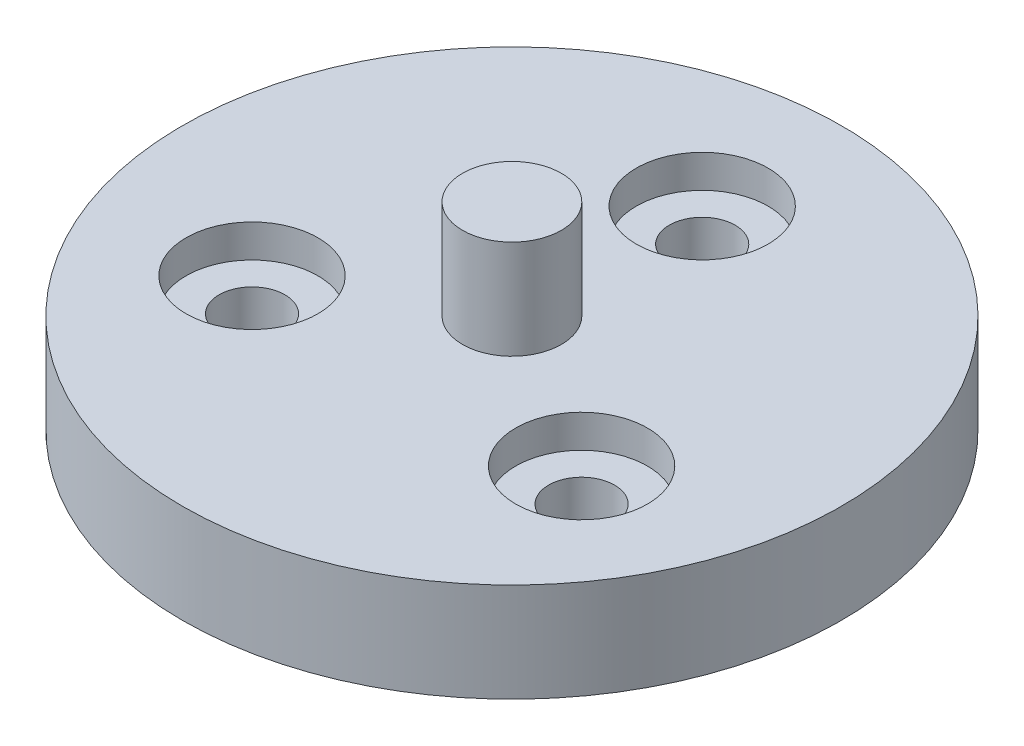
ISO-10303-21;
HEADER;
FILE_DESCRIPTION(('STEP AP214'),'2;1');
FILE_NAME('part.step','',(''),(''),'','','');
FILE_SCHEMA(('AUTOMOTIVE_DESIGN { 1 0 10303 214 1 1 1 1 }'));
ENDSEC;
DATA;
#1=APPLICATION_CONTEXT('core data for automotive mechanical design processes');
#2=APPLICATION_PROTOCOL_DEFINITION('international standard','automotive_design',2000,#1);
#3=PRODUCT_CONTEXT('',#1,'mechanical');
#4=PRODUCT('Part','Part','',(#3));
#5=PRODUCT_RELATED_PRODUCT_CATEGORY('part','',(#4));
#6=PRODUCT_DEFINITION_FORMATION('','',#4);
#7=PRODUCT_DEFINITION_CONTEXT('part definition',#1,'design');
#8=PRODUCT_DEFINITION('design','',#6,#7);
#9=PRODUCT_DEFINITION_SHAPE('','',#8);
#10=(LENGTH_UNIT() NAMED_UNIT(*) SI_UNIT(.MILLI.,.METRE.));
#11=(NAMED_UNIT(*) PLANE_ANGLE_UNIT() SI_UNIT($,.RADIAN.));
#12=(NAMED_UNIT(*) SI_UNIT($,.STERADIAN.) SOLID_ANGLE_UNIT());
#13=UNCERTAINTY_MEASURE_WITH_UNIT(LENGTH_MEASURE(1.E-05),#10,'distance_accuracy_value','');
#14=(GEOMETRIC_REPRESENTATION_CONTEXT(3) GLOBAL_UNCERTAINTY_ASSIGNED_CONTEXT((#13)) GLOBAL_UNIT_ASSIGNED_CONTEXT((#10,
#11,#12)) REPRESENTATION_CONTEXT('',''));
#15=CARTESIAN_POINT('',(0.,0.,0.));
#16=DIRECTION('',(0.,0.,1.));
#17=DIRECTION('',(1.,0.,0.));
#18=AXIS2_PLACEMENT_3D('',#15,#16,#17);
#19=CARTESIAN_POINT('',(0.,3.,-5.77350269189626));
#20=DIRECTION('',(0.,-1.,0.));
#21=DIRECTION('',(0.,0.,-1.));
#22=AXIS2_PLACEMENT_3D('',#19,#20,#21);
#23=CYLINDRICAL_SURFACE('',#22,1.);
#24=CARTESIAN_POINT('',(0.,0.,-5.77350269189626));
#25=DIRECTION('',(0.,1.,0.));
#26=DIRECTION('',(0.,0.,1.));
#27=AXIS2_PLACEMENT_3D('',#24,#25,#26);
#28=CIRCLE('',#27,1.);
#29=CARTESIAN_POINT('',(0.,0.,-4.77350269189626));
#30=VERTEX_POINT('',#29);
#31=EDGE_CURVE('E44',#30,#30,#28,.T.);
#32=ORIENTED_EDGE('',*,*,#31,.F.);
#33=EDGE_LOOP('',(#32));
#34=FACE_BOUND('',#33,.T.);
#35=CARTESIAN_POINT('',(0.,2.,-5.77350269189626));
#36=DIRECTION('',(0.,1.,0.));
#37=DIRECTION('',(0.,0.,1.));
#38=AXIS2_PLACEMENT_3D('',#35,#36,#37);
#39=CIRCLE('',#38,1.);
#40=CARTESIAN_POINT('',(0.,2.,-4.77350269189626));
#41=VERTEX_POINT('',#40);
#42=EDGE_CURVE('E35',#41,#41,#39,.T.);
#43=ORIENTED_EDGE('',*,*,#42,.T.);
#44=EDGE_LOOP('',(#43));
#45=FACE_BOUND('',#44,.T.);
#46=ADVANCED_FACE('F31',(#34,#45),#23,.F.);
#47=CARTESIAN_POINT('',(-5.,3.,2.88675134594813));
#48=DIRECTION('',(0.,-1.,0.));
#49=DIRECTION('',(0.,0.,-1.));
#50=AXIS2_PLACEMENT_3D('',#47,#48,#49);
#51=CYLINDRICAL_SURFACE('',#50,1.);
#52=CARTESIAN_POINT('',(-5.,0.,2.88675134594813));
#53=DIRECTION('',(0.,1.,0.));
#54=DIRECTION('',(0.,0.,1.));
#55=AXIS2_PLACEMENT_3D('',#52,#53,#54);
#56=CIRCLE('',#55,1.);
#57=CARTESIAN_POINT('',(-5.,0.,3.88675134594813));
#58=VERTEX_POINT('',#57);
#59=EDGE_CURVE('E61',#58,#58,#56,.T.);
#60=ORIENTED_EDGE('',*,*,#59,.F.);
#61=EDGE_LOOP('',(#60));
#62=FACE_BOUND('',#61,.T.);
#63=CARTESIAN_POINT('',(-5.,2.,2.88675134594813));
#64=DIRECTION('',(0.,1.,0.));
#65=DIRECTION('',(0.,0.,1.));
#66=AXIS2_PLACEMENT_3D('',#63,#64,#65);
#67=CIRCLE('',#66,1.);
#68=CARTESIAN_POINT('',(-5.,2.,3.88675134594813));
#69=VERTEX_POINT('',#68);
#70=EDGE_CURVE('E51',#69,#69,#67,.T.);
#71=ORIENTED_EDGE('',*,*,#70,.T.);
#72=EDGE_LOOP('',(#71));
#73=FACE_BOUND('',#72,.T.);
#74=ADVANCED_FACE('F128',(#62,#73),#51,.F.);
#75=CARTESIAN_POINT('',(5.,3.,2.88675134594813));
#76=DIRECTION('',(0.,-1.,0.));
#77=DIRECTION('',(0.,0.,-1.));
#78=AXIS2_PLACEMENT_3D('',#75,#76,#77);
#79=CYLINDRICAL_SURFACE('',#78,1.);
#80=CARTESIAN_POINT('',(5.,0.,2.88675134594813));
#81=DIRECTION('',(0.,1.,0.));
#82=DIRECTION('',(0.,0.,1.));
#83=AXIS2_PLACEMENT_3D('',#80,#81,#82);
#84=CIRCLE('',#83,1.);
#85=CARTESIAN_POINT('',(5.,0.,3.88675134594813));
#86=VERTEX_POINT('',#85);
#87=EDGE_CURVE('E57',#86,#86,#84,.T.);
#88=ORIENTED_EDGE('',*,*,#87,.F.);
#89=EDGE_LOOP('',(#88));
#90=FACE_BOUND('',#89,.T.);
#91=CARTESIAN_POINT('',(5.,2.,2.88675134594813));
#92=DIRECTION('',(0.,1.,0.));
#93=DIRECTION('',(0.,0.,1.));
#94=AXIS2_PLACEMENT_3D('',#91,#92,#93);
#95=CIRCLE('',#94,1.);
#96=CARTESIAN_POINT('',(5.,2.,3.88675134594813));
#97=VERTEX_POINT('',#96);
#98=EDGE_CURVE('E49',#97,#97,#95,.T.);
#99=ORIENTED_EDGE('',*,*,#98,.T.);
#100=EDGE_LOOP('',(#99));
#101=FACE_BOUND('',#100,.T.);
#102=ADVANCED_FACE('F104',(#90,#101),#79,.F.);
#103=CARTESIAN_POINT('',(0.,3.,0.));
#104=DIRECTION('',(0.,1.,0.));
#105=DIRECTION('',(0.,0.,1.));
#106=AXIS2_PLACEMENT_3D('',#103,#104,#105);
#107=PLANE('',#106);
#108=CARTESIAN_POINT('',(0.,3.,0.));
#109=DIRECTION('',(0.,1.,0.));
#110=DIRECTION('',(0.,0.,1.));
#111=AXIS2_PLACEMENT_3D('',#108,#109,#110);
#112=CIRCLE('',#111,1.5);
#113=CARTESIAN_POINT('',(0.,3.,1.5));
#114=VERTEX_POINT('',#113);
#115=EDGE_CURVE('E85',#114,#114,#112,.T.);
#116=ORIENTED_EDGE('',*,*,#115,.F.);
#117=EDGE_LOOP('',(#116));
#118=FACE_BOUND('',#117,.T.);
#119=CARTESIAN_POINT('',(0.,3.,-5.77350269189626));
#120=DIRECTION('',(0.,1.,0.));
#121=DIRECTION('',(0.,0.,1.));
#122=AXIS2_PLACEMENT_3D('',#119,#120,#121);
#123=CIRCLE('',#122,2.);
#124=CARTESIAN_POINT('',(0.,3.,-3.77350269189626));
#125=VERTEX_POINT('',#124);
#126=EDGE_CURVE('E80',#125,#125,#123,.T.);
#127=ORIENTED_EDGE('',*,*,#126,.F.);
#128=EDGE_LOOP('',(#127));
#129=FACE_BOUND('',#128,.T.);
#130=CARTESIAN_POINT('',(-5.,3.,2.88675134594813));
#131=DIRECTION('',(0.,1.,0.));
#132=DIRECTION('',(0.,0.,1.));
#133=AXIS2_PLACEMENT_3D('',#130,#131,#132);
#134=CIRCLE('',#133,2.);
#135=CARTESIAN_POINT('',(-5.,3.,4.88675134594813));
#136=VERTEX_POINT('',#135);
#137=EDGE_CURVE('E74',#136,#136,#134,.T.);
#138=ORIENTED_EDGE('',*,*,#137,.F.);
#139=EDGE_LOOP('',(#138));
#140=FACE_BOUND('',#139,.T.);
#141=CARTESIAN_POINT('',(5.,3.,2.88675134594813));
#142=DIRECTION('',(0.,1.,0.));
#143=DIRECTION('',(0.,0.,1.));
#144=AXIS2_PLACEMENT_3D('',#141,#142,#143);
#145=CIRCLE('',#144,2.);
#146=CARTESIAN_POINT('',(5.,3.,4.88675134594813));
#147=VERTEX_POINT('',#146);
#148=EDGE_CURVE('E67',#147,#147,#145,.T.);
#149=ORIENTED_EDGE('',*,*,#148,.F.);
#150=EDGE_LOOP('',(#149));
#151=FACE_BOUND('',#150,.T.);
#152=CARTESIAN_POINT('',(0.,3.,0.));
#153=DIRECTION('',(0.,1.,0.));
#154=DIRECTION('',(0.,0.,1.));
#155=AXIS2_PLACEMENT_3D('',#152,#153,#154);
#156=CIRCLE('',#155,10.);
#157=CARTESIAN_POINT('',(0.,3.,10.));
#158=VERTEX_POINT('',#157);
#159=EDGE_CURVE('E10',#158,#158,#156,.T.);
#160=ORIENTED_EDGE('',*,*,#159,.T.);
#161=EDGE_LOOP('',(#160));
#162=FACE_BOUND('',#161,.T.);
#163=ADVANCED_FACE('F100',(#118,#129,#140,#151,#162),#107,.T.);
#164=CARTESIAN_POINT('',(0.,0.,0.));
#165=DIRECTION('',(0.,1.,0.));
#166=DIRECTION('',(0.,0.,1.));
#167=AXIS2_PLACEMENT_3D('',#164,#165,#166);
#168=PLANE('',#167);
#169=CARTESIAN_POINT('',(0.,0.,0.));
#170=DIRECTION('',(0.,1.,0.));
#171=DIRECTION('',(0.,0.,1.));
#172=AXIS2_PLACEMENT_3D('',#169,#170,#171);
#173=CIRCLE('',#172,10.);
#174=CARTESIAN_POINT('',(0.,0.,10.));
#175=VERTEX_POINT('',#174);
#176=EDGE_CURVE('E39',#175,#175,#173,.T.);
#177=ORIENTED_EDGE('',*,*,#176,.F.);
#178=EDGE_LOOP('',(#177));
#179=FACE_BOUND('',#178,.T.);
#180=ORIENTED_EDGE('',*,*,#31,.T.);
#181=EDGE_LOOP('',(#180));
#182=FACE_BOUND('',#181,.T.);
#183=ORIENTED_EDGE('',*,*,#59,.T.);
#184=EDGE_LOOP('',(#183));
#185=FACE_BOUND('',#184,.T.);
#186=ORIENTED_EDGE('',*,*,#87,.T.);
#187=EDGE_LOOP('',(#186));
#188=FACE_BOUND('',#187,.T.);
#189=ADVANCED_FACE('F103',(#179,#182,#185,#188),#168,.F.);
#190=CARTESIAN_POINT('',(0.,3.,0.));
#191=DIRECTION('',(0.,-1.,0.));
#192=DIRECTION('',(0.,0.,-1.));
#193=AXIS2_PLACEMENT_3D('',#190,#191,#192);
#194=CYLINDRICAL_SURFACE('',#193,10.);
#195=ORIENTED_EDGE('',*,*,#159,.F.);
#196=EDGE_LOOP('',(#195));
#197=FACE_BOUND('',#196,.T.);
#198=ORIENTED_EDGE('',*,*,#176,.T.);
#199=EDGE_LOOP('',(#198));
#200=FACE_BOUND('',#199,.T.);
#201=ADVANCED_FACE('F33',(#197,#200),#194,.T.);
#202=CARTESIAN_POINT('',(5.,2.,2.88675134594813));
#203=DIRECTION('',(0.,1.,0.));
#204=DIRECTION('',(0.,0.,1.));
#205=AXIS2_PLACEMENT_3D('',#202,#203,#204);
#206=CYLINDRICAL_SURFACE('',#205,2.);
#207=CARTESIAN_POINT('',(5.,2.,2.88675134594813));
#208=DIRECTION('',(0.,1.,0.));
#209=DIRECTION('',(0.,0.,1.));
#210=AXIS2_PLACEMENT_3D('',#207,#208,#209);
#211=CIRCLE('',#210,2.);
#212=CARTESIAN_POINT('',(5.,2.,4.88675134594813));
#213=VERTEX_POINT('',#212);
#214=EDGE_CURVE('E70',#213,#213,#211,.T.);
#215=ORIENTED_EDGE('',*,*,#214,.F.);
#216=EDGE_LOOP('',(#215));
#217=FACE_BOUND('',#216,.T.);
#218=ORIENTED_EDGE('',*,*,#148,.T.);
#219=EDGE_LOOP('',(#218));
#220=FACE_BOUND('',#219,.T.);
#221=ADVANCED_FACE('F112',(#217,#220),#206,.F.);
#222=CARTESIAN_POINT('',(5.,2.,2.88675134594813));
#223=DIRECTION('',(0.,1.,0.));
#224=DIRECTION('',(0.,0.,1.));
#225=AXIS2_PLACEMENT_3D('',#222,#223,#224);
#226=PLANE('',#225);
#227=ORIENTED_EDGE('',*,*,#98,.F.);
#228=EDGE_LOOP('',(#227));
#229=FACE_BOUND('',#228,.T.);
#230=ORIENTED_EDGE('',*,*,#214,.T.);
#231=EDGE_LOOP('',(#230));
#232=FACE_BOUND('',#231,.T.);
#233=ADVANCED_FACE('F114',(#229,#232),#226,.T.);
#234=CARTESIAN_POINT('',(-5.,2.,2.88675134594813));
#235=DIRECTION('',(0.,1.,0.));
#236=DIRECTION('',(0.,0.,1.));
#237=AXIS2_PLACEMENT_3D('',#234,#235,#236);
#238=CYLINDRICAL_SURFACE('',#237,2.);
#239=CARTESIAN_POINT('',(-5.,2.,2.88675134594813));
#240=DIRECTION('',(0.,1.,0.));
#241=DIRECTION('',(0.,0.,1.));
#242=AXIS2_PLACEMENT_3D('',#239,#240,#241);
#243=CIRCLE('',#242,2.);
#244=CARTESIAN_POINT('',(-5.,2.,4.88675134594813));
#245=VERTEX_POINT('',#244);
#246=EDGE_CURVE('E77',#245,#245,#243,.T.);
#247=ORIENTED_EDGE('',*,*,#246,.F.);
#248=EDGE_LOOP('',(#247));
#249=FACE_BOUND('',#248,.T.);
#250=ORIENTED_EDGE('',*,*,#137,.T.);
#251=EDGE_LOOP('',(#250));
#252=FACE_BOUND('',#251,.T.);
#253=ADVANCED_FACE('F121',(#249,#252),#238,.F.);
#254=CARTESIAN_POINT('',(-5.,2.,2.88675134594813));
#255=DIRECTION('',(0.,1.,0.));
#256=DIRECTION('',(0.,0.,1.));
#257=AXIS2_PLACEMENT_3D('',#254,#255,#256);
#258=PLANE('',#257);
#259=ORIENTED_EDGE('',*,*,#70,.F.);
#260=EDGE_LOOP('',(#259));
#261=FACE_BOUND('',#260,.T.);
#262=ORIENTED_EDGE('',*,*,#246,.T.);
#263=EDGE_LOOP('',(#262));
#264=FACE_BOUND('',#263,.T.);
#265=ADVANCED_FACE('F190',(#261,#264),#258,.T.);
#266=CARTESIAN_POINT('',(0.,2.,-5.77350269189626));
#267=DIRECTION('',(0.,1.,0.));
#268=DIRECTION('',(0.,0.,1.));
#269=AXIS2_PLACEMENT_3D('',#266,#267,#268);
#270=CYLINDRICAL_SURFACE('',#269,2.);
#271=CARTESIAN_POINT('',(0.,2.,-5.77350269189626));
#272=DIRECTION('',(0.,1.,0.));
#273=DIRECTION('',(0.,0.,1.));
#274=AXIS2_PLACEMENT_3D('',#271,#272,#273);
#275=CIRCLE('',#274,2.);
#276=CARTESIAN_POINT('',(0.,2.,-3.77350269189626));
#277=VERTEX_POINT('',#276);
#278=EDGE_CURVE('E52',#277,#277,#275,.T.);
#279=ORIENTED_EDGE('',*,*,#278,.F.);
#280=EDGE_LOOP('',(#279));
#281=FACE_BOUND('',#280,.T.);
#282=ORIENTED_EDGE('',*,*,#126,.T.);
#283=EDGE_LOOP('',(#282));
#284=FACE_BOUND('',#283,.T.);
#285=ADVANCED_FACE('F200',(#281,#284),#270,.F.);
#286=CARTESIAN_POINT('',(0.,2.,-5.77350269189626));
#287=DIRECTION('',(0.,1.,0.));
#288=DIRECTION('',(0.,0.,1.));
#289=AXIS2_PLACEMENT_3D('',#286,#287,#288);
#290=PLANE('',#289);
#291=ORIENTED_EDGE('',*,*,#42,.F.);
#292=EDGE_LOOP('',(#291));
#293=FACE_BOUND('',#292,.T.);
#294=ORIENTED_EDGE('',*,*,#278,.T.);
#295=EDGE_LOOP('',(#294));
#296=FACE_BOUND('',#295,.T.);
#297=ADVANCED_FACE('F96',(#293,#296),#290,.T.);
#298=CARTESIAN_POINT('',(0.,6.,0.));
#299=DIRECTION('',(0.,-1.,0.));
#300=DIRECTION('',(0.,0.,-1.));
#301=AXIS2_PLACEMENT_3D('',#298,#299,#300);
#302=CYLINDRICAL_SURFACE('',#301,1.5);
#303=CARTESIAN_POINT('',(0.,6.,0.));
#304=DIRECTION('',(0.,1.,0.));
#305=DIRECTION('',(0.,0.,1.));
#306=AXIS2_PLACEMENT_3D('',#303,#304,#305);
#307=CIRCLE('',#306,1.5);
#308=CARTESIAN_POINT('',(0.,6.,1.5));
#309=VERTEX_POINT('',#308);
#310=EDGE_CURVE('E71',#309,#309,#307,.T.);
#311=ORIENTED_EDGE('',*,*,#310,.F.);
#312=EDGE_LOOP('',(#311));
#313=FACE_BOUND('',#312,.T.);
#314=ORIENTED_EDGE('',*,*,#115,.T.);
#315=EDGE_LOOP('',(#314));
#316=FACE_BOUND('',#315,.T.);
#317=ADVANCED_FACE('F93',(#313,#316),#302,.T.);
#318=CARTESIAN_POINT('',(0.,6.,0.));
#319=DIRECTION('',(0.,1.,0.));
#320=DIRECTION('',(0.,0.,1.));
#321=AXIS2_PLACEMENT_3D('',#318,#319,#320);
#322=PLANE('',#321);
#323=ORIENTED_EDGE('',*,*,#310,.T.);
#324=EDGE_LOOP('',(#323));
#325=FACE_BOUND('',#324,.T.);
#326=ADVANCED_FACE('F91',(#325),#322,.T.);
#327=CLOSED_SHELL('',(#46,#74,#102,#163,#189,#201,#221,#233,#253,#265,#285,#297,#317,#326));
#328=MANIFOLD_SOLID_BREP('B2',#327);
#329=ADVANCED_BREP_SHAPE_REPRESENTATION('',(#18,#328),#14);
#330=SHAPE_DEFINITION_REPRESENTATION(#9,#329);
ENDSEC;
END-ISO-10303-21;
